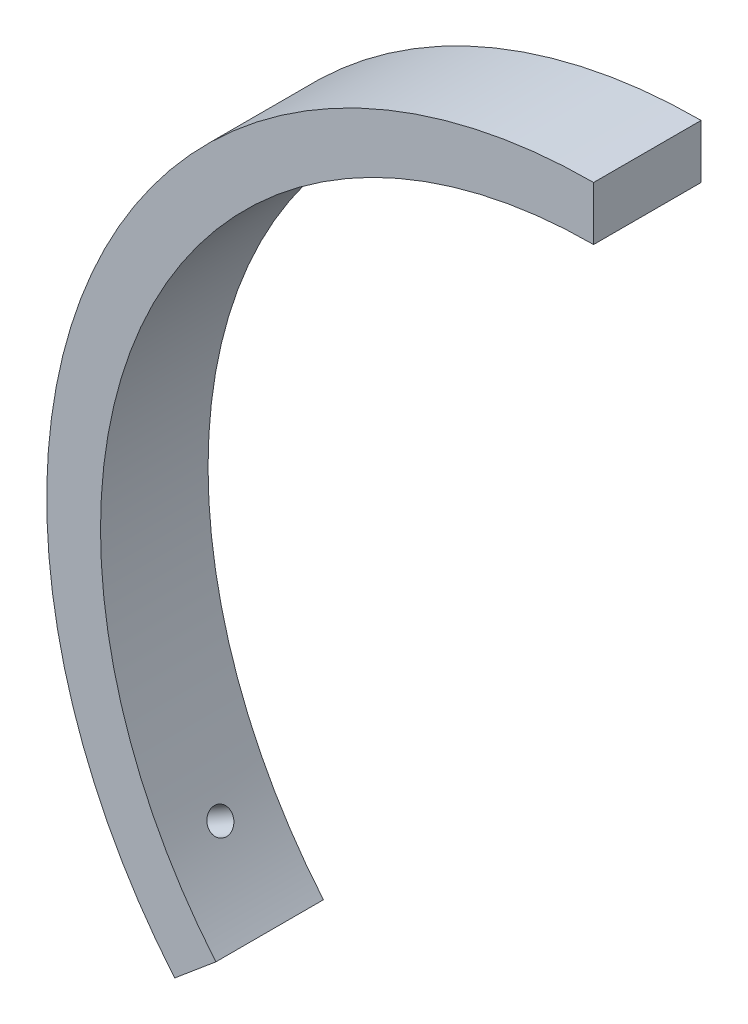
ISO-10303-21;
HEADER;
FILE_DESCRIPTION(('STEP AP214'),'2;1');
FILE_NAME('part.step','',(''),(''),'','','');
FILE_SCHEMA(('AUTOMOTIVE_DESIGN { 1 0 10303 214 1 1 1 1 }'));
ENDSEC;
DATA;
#1=APPLICATION_CONTEXT('core data for automotive mechanical design processes');
#2=APPLICATION_PROTOCOL_DEFINITION('international standard','automotive_design',2000,#1);
#3=PRODUCT_CONTEXT('',#1,'mechanical');
#4=PRODUCT('Part','Part','',(#3));
#5=PRODUCT_RELATED_PRODUCT_CATEGORY('part','',(#4));
#6=PRODUCT_DEFINITION_FORMATION('','',#4);
#7=PRODUCT_DEFINITION_CONTEXT('part definition',#1,'design');
#8=PRODUCT_DEFINITION('design','',#6,#7);
#9=PRODUCT_DEFINITION_SHAPE('','',#8);
#10=(LENGTH_UNIT() NAMED_UNIT(*) SI_UNIT(.MILLI.,.METRE.));
#11=(NAMED_UNIT(*) PLANE_ANGLE_UNIT() SI_UNIT($,.RADIAN.));
#12=(NAMED_UNIT(*) SI_UNIT($,.STERADIAN.) SOLID_ANGLE_UNIT());
#13=UNCERTAINTY_MEASURE_WITH_UNIT(LENGTH_MEASURE(1.E-05),#10,'distance_accuracy_value','');
#14=(GEOMETRIC_REPRESENTATION_CONTEXT(3) GLOBAL_UNCERTAINTY_ASSIGNED_CONTEXT((#13)) GLOBAL_UNIT_ASSIGNED_CONTEXT((#10,
#11,#12)) REPRESENTATION_CONTEXT('',''));
#15=CARTESIAN_POINT('',(0.,0.,0.));
#16=DIRECTION('',(0.,0.,1.));
#17=DIRECTION('',(1.,0.,0.));
#18=AXIS2_PLACEMENT_3D('',#15,#16,#17);
#19=CARTESIAN_POINT('',(0.,0.,20.));
#20=DIRECTION('',(0.,0.,-1.));
#21=DIRECTION('',(-1.,0.,0.));
#22=AXIS2_PLACEMENT_3D('',#19,#20,#21);
#23=CYLINDRICAL_SURFACE('',#22,101.7);
#24=CARTESIAN_POINT('',(-87.6731606146973,-51.5393724636004,5.37138605957881));
#25=CARTESIAN_POINT('',(-87.7893116330558,-51.3417876048177,5.33006265687796));
#26=CARTESIAN_POINT('',(-87.9064585888786,-51.1409689136169,5.30654677979392));
#27=CARTESIAN_POINT('',(-88.1398383984182,-50.7376908596725,5.29582330103893));
#28=CARTESIAN_POINT('',(-88.2560704703865,-50.5352303424387,5.3086439505002));
#29=CARTESIAN_POINT('',(-88.4942774234178,-50.1170168847732,5.37286532123307));
#30=CARTESIAN_POINT('',(-88.6159312601271,-49.9015508898564,5.42737171335312));
#31=CARTESIAN_POINT('',(-88.8515868699187,-49.480741339662,5.57688931514213));
#32=CARTESIAN_POINT('',(-88.9655877767914,-49.275398930936,5.67190510101817));
#33=CARTESIAN_POINT('',(-89.1837527546582,-48.8794403309165,5.90014047000529));
#34=CARTESIAN_POINT('',(-89.2878554164266,-48.688917257579,6.03358016859668));
#35=CARTESIAN_POINT('',(-89.4830664481307,-48.329212469479,6.33438000324875));
#36=CARTESIAN_POINT('',(-89.5741740931517,-48.1600319453513,6.50174203037455));
#37=CARTESIAN_POINT('',(-89.7430198205838,-47.8446761684187,6.8688629444793));
#38=CARTESIAN_POINT('',(-89.8204824720964,-47.6989790179213,7.06915905003311));
#39=CARTESIAN_POINT('',(-89.958420060891,-47.4383228362987,7.49411402617155));
#40=CARTESIAN_POINT('',(-90.0188930193309,-47.3233673858294,7.71877573047248));
#41=CARTESIAN_POINT('',(-90.1228603795412,-47.1250772328914,8.19130465911183));
#42=CARTESIAN_POINT('',(-90.1659589650372,-47.0424807879636,8.4395689001985));
#43=CARTESIAN_POINT('',(-90.2325058300599,-46.914711058343,8.94807336455945));
#44=CARTESIAN_POINT('',(-90.2559522860642,-46.8695412464741,9.20831469682577));
#45=CARTESIAN_POINT('',(-90.2830069158963,-46.817406678049,9.73779395481841));
#46=CARTESIAN_POINT('',(-90.286295269389,-46.8110578434364,10.0071090795251));
#47=CARTESIAN_POINT('',(-90.2721221548282,-46.8383836783286,10.5431602043939));
#48=CARTESIAN_POINT('',(-90.2546596969395,-46.8720602570873,10.8098960809114));
#49=CARTESIAN_POINT('',(-90.1991563780707,-46.9787802494058,11.3344735671105));
#50=CARTESIAN_POINT('',(-90.1610206715675,-47.0520050982691,11.5922683107071));
#51=CARTESIAN_POINT('',(-90.0647994016363,-47.2359250891052,12.09017809346));
#52=CARTESIAN_POINT('',(-90.0067142416321,-47.346619473357,12.3302934900142));
#53=CARTESIAN_POINT('',(-89.8722672086801,-47.6013243433578,12.7838336874709));
#54=CARTESIAN_POINT('',(-89.7960567956803,-47.7450584229003,12.9974584625443));
#55=CARTESIAN_POINT('',(-89.6266985116987,-48.0622214570176,13.3937195909682));
#56=CARTESIAN_POINT('',(-89.5335522622222,-48.2356475686648,13.5763589077581));
#57=CARTESIAN_POINT('',(-89.3343302334667,-48.6036039255416,13.9017523095551));
#58=CARTESIAN_POINT('',(-89.2285275830666,-48.79768093828,14.045185910872));
#59=CARTESIAN_POINT('',(-89.0052343568402,-49.2037787692609,14.2919558649287));
#60=CARTESIAN_POINT('',(-88.8877453711749,-49.4157971456357,14.3952976636126));
#61=CARTESIAN_POINT('',(-88.6468853545354,-49.8465568692261,14.5566291143314));
#62=CARTESIAN_POINT('',(-88.5237007135631,-50.0650475194028,14.6155669404087));
#63=CARTESIAN_POINT('',(-88.2725120762428,-50.5066142109021,14.6898387182743));
#64=CARTESIAN_POINT('',(-88.1445085694639,-50.7296897853827,14.7051770874693));
#65=CARTESIAN_POINT('',(-87.8892731793871,-51.1705933175647,14.6918448605747));
#66=CARTESIAN_POINT('',(-87.7620574115498,-51.3884502985518,14.6638149328291));
#67=CARTESIAN_POINT('',(-87.5102500502238,-51.8160953233809,14.5658486478778));
#68=CARTESIAN_POINT('',(-87.3856584134618,-52.0258835003292,14.4959129822818));
#69=CARTESIAN_POINT('',(-87.1427212178819,-52.4317859325544,14.3163151657449));
#70=CARTESIAN_POINT('',(-87.0243794495851,-52.6278919122632,14.2066292163549));
#71=CARTESIAN_POINT('',(-86.7975353179302,-53.0011852710067,13.9509326103969));
#72=CARTESIAN_POINT('',(-86.6890335892688,-53.1783714298163,13.8049196129527));
#73=CARTESIAN_POINT('',(-86.4835195568123,-53.5119601271126,13.4784380021359));
#74=CARTESIAN_POINT('',(-86.3867067034267,-53.6680062724526,13.2974799201985));
#75=CARTESIAN_POINT('',(-86.2094126961625,-53.9523429569673,12.9078855341675));
#76=CARTESIAN_POINT('',(-86.128933267347,-54.0806305645042,12.6992463103602));
#77=CARTESIAN_POINT('',(-85.9851337272031,-54.308981271561,12.2553616304044));
#78=CARTESIAN_POINT('',(-85.922223864525,-54.4083714989009,12.0196370698104));
#79=CARTESIAN_POINT('',(-85.8178338247675,-54.5728772778996,11.5320371096162));
#80=CARTESIAN_POINT('',(-85.7763558916115,-54.6379892406371,11.2801600219484));
#81=CARTESIAN_POINT('',(-85.715520145745,-54.7333802116288,10.7624221522776));
#82=CARTESIAN_POINT('',(-85.6965842853602,-54.7629948332925,10.4963891668723));
#83=CARTESIAN_POINT('',(-85.6828204868774,-54.7845273658888,9.96217524836672));
#84=CARTESIAN_POINT('',(-85.687994125781,-54.7764428109192,9.69399417590553));
#85=CARTESIAN_POINT('',(-85.7224394822637,-54.7225217970382,9.16070441254647));
#86=CARTESIAN_POINT('',(-85.7519152687983,-54.6763656434672,8.89564108879532));
#87=CARTESIAN_POINT('',(-85.8343036648466,-54.5469353145662,8.37853180452171));
#88=CARTESIAN_POINT('',(-85.8872156944271,-54.4636620577039,8.12648552206299));
#89=CARTESIAN_POINT('',(-86.0145285906156,-54.2623712210915,7.64379752727602));
#90=CARTESIAN_POINT('',(-86.0888381298458,-54.1445012641202,7.41307023796452));
#91=CARTESIAN_POINT('',(-86.256683118346,-53.8767064021572,6.97872178712104));
#92=CARTESIAN_POINT('',(-86.3502207385159,-53.726777877594,6.77510369056728));
#93=CARTESIAN_POINT('',(-86.5518892354175,-53.4012780981364,6.40429753594902));
#94=CARTESIAN_POINT('',(-86.6597720799409,-53.2261392251365,6.23659482648169));
#95=CARTESIAN_POINT('',(-86.8877007116658,-52.8532399599665,5.93914637551925));
#96=CARTESIAN_POINT('',(-87.0077336107077,-52.6555035100103,5.809360969779));
#97=CARTESIAN_POINT('',(-87.2189609069851,-52.3046030563924,5.62436487477632));
#98=CARTESIAN_POINT('',(-87.3080824281518,-52.1557288610119,5.55845686471806));
#99=CARTESIAN_POINT('',(-87.4889797985673,-51.8517085505529,5.44840767293308));
#100=CARTESIAN_POINT('',(-87.5807550311265,-51.6965638893716,5.40426147639104));
#101=CARTESIAN_POINT('',(-87.6731606146973,-51.5393724636004,5.37138605957881));
#102=B_SPLINE_CURVE_WITH_KNOTS('',3,(#24,#25,#26,#27,#28,#29,#30,#31,#32,#33,#34,#35,#36,#37,
#38,#39,#40,#41,#42,#43,#44,#45,#46,#47,#48,#49,#50,#51,#52,#53,#54,#55,#56,#57,#58,#59,#60,#61,
#62,#63,#64,#65,#66,#67,#68,#69,#70,#71,#72,#73,#74,#75,#76,#77,#78,#79,#80,#81,#82,#83,#84,#85,
#86,#87,#88,#89,#90,#91,#92,#93,#94,#95,#96,#97,#98,#99,#100,#101),.UNSPECIFIED.,.T.,.F.,(4,2,2,
2,2,2,2,2,2,2,2,2,2,2,2,2,2,2,2,2,2,2,2,2,2,2,2,2,2,2,2,2,2,2,2,2,2,2,4),(0.,0.698100781084419,
1.39674447444748,2.15321933193793,2.90977966844717,3.67076333220916,4.43178943013516,
5.20675400716698,5.98180880933315,6.77363901890721,7.56554269432211,8.36997854588397,
9.17445277141288,9.98264942164338,10.7908297292403,11.5924802790987,12.3940541160796,
13.180698404476,13.9672358001464,14.7364608098151,15.5056078804209,16.2635005608633,
17.0213807334329,17.7797153996165,18.5380989447379,19.3079967335326,20.0779757932101,
20.8646631935143,21.6514329433219,22.4527091775072,23.2540378238858,24.0621647170801,
24.870271614175,25.6749792713004,26.4797778319348,27.2721312664271,28.0636528494723,
28.6191648609235,29.1745487996866),.UNSPECIFIED.);
#103=CARTESIAN_POINT('',(-87.6731606146973,-51.5393724636004,5.37138605957881));
#104=VERTEX_POINT('',#103);
#105=EDGE_CURVE('E11',#104,#104,#102,.T.);
#106=ORIENTED_EDGE('',*,*,#105,.T.);
#107=EDGE_LOOP('',(#106));
#108=FACE_BOUND('',#107,.T.);
#109=CARTESIAN_POINT('',(0.,0.,0.));
#110=DIRECTION('',(0.,0.,1.));
#111=DIRECTION('',(1.,0.,0.));
#112=AXIS2_PLACEMENT_3D('',#109,#110,#111);
#113=CIRCLE('',#112,101.7);
#114=CARTESIAN_POINT('',(0.,101.7,0.));
#115=VERTEX_POINT('',#114);
#116=CARTESIAN_POINT('',(-77.9067198652002,-65.371499905121,0.));
#117=VERTEX_POINT('',#116);
#118=EDGE_CURVE('E113',#115,#117,#113,.T.);
#119=ORIENTED_EDGE('',*,*,#118,.T.);
#120=DIRECTION('',(0.,0.,-1.));
#121=VECTOR('',#120,1.);
#122=CARTESIAN_POINT('',(-77.9067198652002,-65.371499905121,20.));
#123=LINE('',#122,#121);
#124=CARTESIAN_POINT('',(-77.9067198652002,-65.371499905121,20.));
#125=VERTEX_POINT('',#124);
#126=EDGE_CURVE('E56',#125,#117,#123,.T.);
#127=ORIENTED_EDGE('',*,*,#126,.F.);
#128=CARTESIAN_POINT('',(0.,0.,20.));
#129=DIRECTION('',(0.,0.,1.));
#130=DIRECTION('',(1.,0.,0.));
#131=AXIS2_PLACEMENT_3D('',#128,#129,#130);
#132=CIRCLE('',#131,101.7);
#133=CARTESIAN_POINT('',(0.,101.7,20.));
#134=VERTEX_POINT('',#133);
#135=EDGE_CURVE('E88',#134,#125,#132,.T.);
#136=ORIENTED_EDGE('',*,*,#135,.F.);
#137=DIRECTION('',(0.,0.,-1.));
#138=VECTOR('',#137,1.);
#139=CARTESIAN_POINT('',(0.,101.7,20.));
#140=LINE('',#139,#138);
#141=EDGE_CURVE('E109',#134,#115,#140,.T.);
#142=ORIENTED_EDGE('',*,*,#141,.T.);
#143=EDGE_LOOP('',(#119,#127,#136,#142));
#144=FACE_BOUND('',#143,.T.);
#145=ADVANCED_FACE('F41',(#108,#144),#23,.T.);
#146=CARTESIAN_POINT('',(0.,0.,20.));
#147=DIRECTION('',(0.642787609686538,-0.766044443118979,0.));
#148=DIRECTION('',(0.766044443118979,0.642787609686538,0.));
#149=AXIS2_PLACEMENT_3D('',#146,#147,#148);
#150=PLANE('',#149);
#151=DIRECTION('',(-0.766044443118979,-0.642787609686538,0.));
#152=VECTOR('',#151,1.);
#153=CARTESIAN_POINT('',(0.,0.,0.));
#154=LINE('',#153,#152);
#155=CARTESIAN_POINT('',(-70.2462754340104,-58.9436238082556,0.));
#156=VERTEX_POINT('',#155);
#157=EDGE_CURVE('E98',#156,#117,#154,.T.);
#158=ORIENTED_EDGE('',*,*,#157,.F.);
#159=DIRECTION('',(0.,0.,-1.));
#160=VECTOR('',#159,1.);
#161=CARTESIAN_POINT('',(-70.2462754340104,-58.9436238082556,20.));
#162=LINE('',#161,#160);
#163=CARTESIAN_POINT('',(-70.2462754340104,-58.9436238082556,20.));
#164=VERTEX_POINT('',#163);
#165=EDGE_CURVE('E94',#164,#156,#162,.T.);
#166=ORIENTED_EDGE('',*,*,#165,.F.);
#167=DIRECTION('',(-0.766044443118979,-0.642787609686538,0.));
#168=VECTOR('',#167,1.);
#169=CARTESIAN_POINT('',(0.,0.,20.));
#170=LINE('',#169,#168);
#171=EDGE_CURVE('E96',#164,#125,#170,.T.);
#172=ORIENTED_EDGE('',*,*,#171,.T.);
#173=ORIENTED_EDGE('',*,*,#126,.T.);
#174=EDGE_LOOP('',(#158,#166,#172,#173));
#175=FACE_BOUND('',#174,.T.);
#176=ADVANCED_FACE('F95',(#175),#150,.T.);
#177=CARTESIAN_POINT('',(0.,0.,20.));
#178=DIRECTION('',(0.,0.,-1.));
#179=DIRECTION('',(-1.,0.,0.));
#180=AXIS2_PLACEMENT_3D('',#177,#178,#179);
#181=CYLINDRICAL_SURFACE('',#180,91.7);
#182=CARTESIAN_POINT('',(-78.2656205102342,-47.7847532812299,10.));
#183=CARTESIAN_POINT('',(-78.2656236318076,-47.7847486201117,9.87363692343285));
#184=CARTESIAN_POINT('',(-78.2711896148588,-47.7756354658249,9.74718270585471));
#185=CARTESIAN_POINT('',(-78.2932969867482,-47.7393975671236,9.497758285892));
#186=CARTESIAN_POINT('',(-78.309851519022,-47.7122512531642,9.37479243984287));
#187=CARTESIAN_POINT('',(-78.3534076959326,-47.6406889854945,9.13599430159358));
#188=CARTESIAN_POINT('',(-78.3804042697331,-47.5962814140982,9.0201585784823));
#189=CARTESIAN_POINT('',(-78.4439852038762,-47.4914195058461,8.79888591241833));
#190=CARTESIAN_POINT('',(-78.4805672092826,-47.4309691103232,8.69344642407721));
#191=CARTESIAN_POINT('',(-78.5621898370563,-47.2956504813954,8.49588944369544));
#192=CARTESIAN_POINT('',(-78.6072329322359,-47.2207780328821,8.40377586020987));
#193=CARTESIAN_POINT('',(-78.7043801442952,-47.0586809774138,8.23551809461001));
#194=CARTESIAN_POINT('',(-78.7564845409362,-46.9714558810538,8.15937454551635));
#195=CARTESIAN_POINT('',(-78.8661705955602,-46.7870562003433,8.02521479750834));
#196=CARTESIAN_POINT('',(-78.9237528416096,-46.6898805476799,7.96720054770924));
#197=CARTESIAN_POINT('',(-79.0426619786805,-46.4882917290246,7.87095906402027));
#198=CARTESIAN_POINT('',(-79.1039888571679,-46.3838785872579,7.83273176390357));
#199=CARTESIAN_POINT('',(-79.2285673052162,-46.1707628905713,7.77715662963742));
#200=CARTESIAN_POINT('',(-79.2918184831358,-46.0620612071538,7.75980457563598));
#201=CARTESIAN_POINT('',(-79.4184299112134,-45.8434177078927,7.74645951020535));
#202=CARTESIAN_POINT('',(-79.4817901610147,-45.7334758960998,7.7504664290308));
#203=CARTESIAN_POINT('',(-79.6068141873745,-45.5155019966988,7.77972195919829));
#204=CARTESIAN_POINT('',(-79.6684783258359,-45.4074695034819,7.80496600224749));
#205=CARTESIAN_POINT('',(-79.7884191941834,-45.1963815917779,7.87597213605008));
#206=CARTESIAN_POINT('',(-79.8466959179018,-45.0933261823529,7.92173426416034));
#207=CARTESIAN_POINT('',(-79.9582921476212,-44.8951496875136,8.03248278178278));
#208=CARTESIAN_POINT('',(-80.0116111126083,-44.8000294681406,8.09747126613675));
#209=CARTESIAN_POINT('',(-80.1118737859085,-44.6204915768785,8.24482612392297));
#210=CARTESIAN_POINT('',(-80.1588174853279,-44.5360739199198,8.32719252159753));
#211=CARTESIAN_POINT('',(-80.2451234840933,-44.3803796839506,8.50699099402178));
#212=CARTESIAN_POINT('',(-80.284483781115,-44.3091065758436,8.60442703555646));
#213=CARTESIAN_POINT('',(-80.354603804329,-44.1818169120052,8.81158491982618));
#214=CARTESIAN_POINT('',(-80.3853635292177,-44.1258003585864,8.92130676442362));
#215=CARTESIAN_POINT('',(-80.4375091042752,-44.0306721089047,9.14992383726267));
#216=CARTESIAN_POINT('',(-80.4588948934593,-43.9915605226215,9.26881912517866));
#217=CARTESIAN_POINT('',(-80.4917599584802,-43.9313983831992,9.51240703657727));
#218=CARTESIAN_POINT('',(-80.5032392525214,-43.9103477968708,9.63709964940615));
#219=CARTESIAN_POINT('',(-80.5160058069759,-43.8869341682758,9.88870775887593));
#220=CARTESIAN_POINT('',(-80.5172957248277,-43.8845662534783,10.0156226672768));
#221=CARTESIAN_POINT('',(-80.5096587179809,-43.8985753108233,10.2681032784172));
#222=CARTESIAN_POINT('',(-80.5007318010463,-43.9149522687214,10.3936689821819));
#223=CARTESIAN_POINT('',(-80.4728832979517,-43.9659628491914,10.639871330327));
#224=CARTESIAN_POINT('',(-80.4539629211486,-44.0005942627026,10.760508569222));
#225=CARTESIAN_POINT('',(-80.4065978732613,-44.0870892176149,10.9934477382314));
#226=CARTESIAN_POINT('',(-80.3781531897562,-44.1389527814888,11.1057496574753));
#227=CARTESIAN_POINT('',(-80.3124452960756,-44.2583976214394,11.3188558769861));
#228=CARTESIAN_POINT('',(-80.2751802567442,-44.325982157664,11.4196577859589));
#229=CARTESIAN_POINT('',(-80.1927810613704,-44.4748815229401,11.6068785605252));
#230=CARTESIAN_POINT('',(-80.1476468908451,-44.5561963772619,11.6932973996465));
#231=CARTESIAN_POINT('',(-80.0506644114338,-44.7302026759565,11.8493173786471));
#232=CARTESIAN_POINT('',(-79.9988146774414,-44.8228965348439,11.9189149398809));
#233=CARTESIAN_POINT('',(-79.88977430385,-45.0169560561817,12.0392922359785));
#234=CARTESIAN_POINT('',(-79.8325836741722,-45.1183217025236,12.0900720057969));
#235=CARTESIAN_POINT('',(-79.714407280841,-45.3267869391484,12.171366006957));
#236=CARTESIAN_POINT('',(-79.6534219535068,-45.433885870014,12.2018825634969));
#237=CARTESIAN_POINT('',(-79.5293281945249,-45.6507563882171,12.241791518377));
#238=CARTESIAN_POINT('',(-79.4662197628535,-45.7605279755844,12.2511839164819));
#239=CARTESIAN_POINT('',(-79.3396722338786,-45.9795868440687,12.2485776427374));
#240=CARTESIAN_POINT('',(-79.2762332283575,-46.0888742454955,12.236584622665));
#241=CARTESIAN_POINT('',(-79.1508304064626,-46.3039041955134,12.1915595454562));
#242=CARTESIAN_POINT('',(-79.0888665930271,-46.4096467370442,12.1585274464178));
#243=CARTESIAN_POINT('',(-78.9682294043522,-46.6146210906344,12.0723623882078));
#244=CARTESIAN_POINT('',(-78.909556087056,-46.7138527880482,12.0192290751972));
#245=CARTESIAN_POINT('',(-78.7972546870713,-46.9030358350048,11.8943725575734));
#246=CARTESIAN_POINT('',(-78.7436264168544,-46.9929875295048,11.8226500443083));
#247=CARTESIAN_POINT('',(-78.6430321875637,-47.1611398008599,11.662637323475));
#248=CARTESIAN_POINT('',(-78.5960672815112,-47.2393385204904,11.5743445023862));
#249=CARTESIAN_POINT('',(-78.5102457453378,-47.3818346233771,11.383674554477));
#250=CARTESIAN_POINT('',(-78.4713911283265,-47.4461285553748,11.2812939412695));
#251=CARTESIAN_POINT('',(-78.4029981658759,-47.5590606902132,11.0653219536025));
#252=CARTESIAN_POINT('',(-78.3734653450237,-47.6076896094926,10.9517239833025));
#253=CARTESIAN_POINT('',(-78.3247059551122,-47.6878670092393,10.7166758939017));
#254=CARTESIAN_POINT('',(-78.3054670746556,-47.7194358937045,10.5952353501831));
#255=CARTESIAN_POINT('',(-78.2830156142081,-47.7562532203224,10.3941878426015));
#256=CARTESIAN_POINT('',(-78.2765014500823,-47.766927801724,10.3158863126379));
#257=CARTESIAN_POINT('',(-78.2678029200397,-47.7811792925438,10.1584017951243));
#258=CARTESIAN_POINT('',(-78.2656185532755,-47.7847562033511,10.079218807747));
#259=CARTESIAN_POINT('',(-78.2656205102342,-47.7847532812299,10.));
#260=B_SPLINE_CURVE_WITH_KNOTS('',3,(#182,#183,#184,#185,#186,#187,#188,#189,#190,#191,#192,
#193,#194,#195,#196,#197,#198,#199,#200,#201,#202,#203,#204,#205,#206,#207,#208,#209,#210,#211,
#212,#213,#214,#215,#216,#217,#218,#219,#220,#221,#222,#223,#224,#225,#226,#227,#228,#229,#230,
#231,#232,#233,#234,#235,#236,#237,#238,#239,#240,#241,#242,#243,#244,#245,#246,#247,#248,#249,
#250,#251,#252,#253,#254,#255,#256,#257,#258,#259),.UNSPECIFIED.,.T.,.F.,(4,2,2,2,2,2,2,2,2,2,2,
2,2,2,2,2,2,2,2,2,2,2,2,2,2,2,2,2,2,2,2,2,2,2,2,2,2,2,4),(0.,0.378800074193792,
0.758054050667171,1.13712408560226,1.51610107829431,1.89518900246264,2.27429195008933,
2.65343564177951,3.03257806446913,3.41164383206789,3.79070836187007,4.16969137238964,
4.54867507291878,4.9277000815074,5.30672561884169,5.68585109747745,6.06497663358449,
6.44410463615816,6.82323194203569,7.20226036641234,7.58128850276096,7.9602707815904,
8.33925355466158,8.71831498973294,9.0973771224643,9.47651982798731,9.85566182923695,
10.2347603165251,10.6138588080384,10.9928571255676,11.3718561979239,11.7508619420617,
12.1298535926739,12.5089050693435,12.8880505213439,13.2674202548157,13.6463352478506,
13.8838104418736,14.1212855894192),.UNSPECIFIED.);
#261=CARTESIAN_POINT('',(-78.2656205102342,-47.7847532812299,10.));
#262=VERTEX_POINT('',#261);
#263=EDGE_CURVE('E45',#262,#262,#260,.T.);
#264=ORIENTED_EDGE('',*,*,#263,.F.);
#265=EDGE_LOOP('',(#264));
#266=FACE_BOUND('',#265,.T.);
#267=CARTESIAN_POINT('',(0.,0.,0.));
#268=DIRECTION('',(0.,0.,1.));
#269=DIRECTION('',(1.,0.,0.));
#270=AXIS2_PLACEMENT_3D('',#267,#268,#269);
#271=CIRCLE('',#270,91.7);
#272=CARTESIAN_POINT('',(0.,91.7,0.));
#273=VERTEX_POINT('',#272);
#274=EDGE_CURVE('E117',#273,#156,#271,.T.);
#275=ORIENTED_EDGE('',*,*,#274,.F.);
#276=DIRECTION('',(0.,0.,-1.));
#277=VECTOR('',#276,1.);
#278=CARTESIAN_POINT('',(0.,91.7,20.));
#279=LINE('',#278,#277);
#280=CARTESIAN_POINT('',(0.,91.7,20.));
#281=VERTEX_POINT('',#280);
#282=EDGE_CURVE('E80',#281,#273,#279,.T.);
#283=ORIENTED_EDGE('',*,*,#282,.F.);
#284=CARTESIAN_POINT('',(0.,0.,20.));
#285=DIRECTION('',(0.,0.,1.));
#286=DIRECTION('',(1.,0.,0.));
#287=AXIS2_PLACEMENT_3D('',#284,#285,#286);
#288=CIRCLE('',#287,91.7);
#289=EDGE_CURVE('E105',#281,#164,#288,.T.);
#290=ORIENTED_EDGE('',*,*,#289,.T.);
#291=ORIENTED_EDGE('',*,*,#165,.T.);
#292=EDGE_LOOP('',(#275,#283,#290,#291));
#293=FACE_BOUND('',#292,.T.);
#294=ADVANCED_FACE('F107',(#266,#293),#181,.F.);
#295=CARTESIAN_POINT('',(0.,0.,20.));
#296=DIRECTION('',(-1.,0.,0.));
#297=DIRECTION('',(0.,0.,1.));
#298=AXIS2_PLACEMENT_3D('',#295,#296,#297);
#299=PLANE('',#298);
#300=DIRECTION('',(0.,1.,0.));
#301=VECTOR('',#300,1.);
#302=CARTESIAN_POINT('',(0.,0.,0.));
#303=LINE('',#302,#301);
#304=EDGE_CURVE('E83',#273,#115,#303,.T.);
#305=ORIENTED_EDGE('',*,*,#304,.T.);
#306=ORIENTED_EDGE('',*,*,#141,.F.);
#307=DIRECTION('',(0.,1.,0.));
#308=VECTOR('',#307,1.);
#309=CARTESIAN_POINT('',(0.,0.,20.));
#310=LINE('',#309,#308);
#311=EDGE_CURVE('E64',#281,#134,#310,.T.);
#312=ORIENTED_EDGE('',*,*,#311,.F.);
#313=ORIENTED_EDGE('',*,*,#282,.T.);
#314=EDGE_LOOP('',(#305,#306,#312,#313));
#315=FACE_BOUND('',#314,.T.);
#316=ADVANCED_FACE('F138',(#315),#299,.F.);
#317=CARTESIAN_POINT('',(0.,0.,20.));
#318=DIRECTION('',(0.,0.,1.));
#319=DIRECTION('',(1.,0.,0.));
#320=AXIS2_PLACEMENT_3D('',#317,#318,#319);
#321=PLANE('',#320);
#322=ORIENTED_EDGE('',*,*,#135,.T.);
#323=ORIENTED_EDGE('',*,*,#171,.F.);
#324=ORIENTED_EDGE('',*,*,#289,.F.);
#325=ORIENTED_EDGE('',*,*,#311,.T.);
#326=EDGE_LOOP('',(#322,#323,#324,#325));
#327=FACE_BOUND('',#326,.T.);
#328=ADVANCED_FACE('F104',(#327),#321,.T.);
#329=CARTESIAN_POINT('',(0.,0.,0.));
#330=DIRECTION('',(0.,0.,1.));
#331=DIRECTION('',(1.,0.,0.));
#332=AXIS2_PLACEMENT_3D('',#329,#330,#331);
#333=PLANE('',#332);
#334=ORIENTED_EDGE('',*,*,#118,.F.);
#335=ORIENTED_EDGE('',*,*,#304,.F.);
#336=ORIENTED_EDGE('',*,*,#274,.T.);
#337=ORIENTED_EDGE('',*,*,#157,.T.);
#338=EDGE_LOOP('',(#334,#335,#336,#337));
#339=FACE_BOUND('',#338,.T.);
#340=ADVANCED_FACE('F130',(#339),#333,.F.);
#341=CARTESIAN_POINT('',(-88.0747835648775,-50.8499999999998,10.));
#342=DIRECTION('',(-0.86602540378444,-0.499999999999998,0.));
#343=DIRECTION('',(0.499999999999998,-0.86602540378444,0.));
#344=AXIS2_PLACEMENT_3D('',#341,#342,#343);
#345=CONICAL_SURFACE('',#344,4.7,0.785398163397448);
#346=CARTESIAN_POINT('',(-85.9530213256056,-49.6249999999998,10.));
#347=DIRECTION('',(-0.86602540378444,-0.499999999999998,0.));
#348=DIRECTION('',(0.499999999999998,-0.86602540378444,0.));
#349=AXIS2_PLACEMENT_3D('',#346,#347,#348);
#350=CIRCLE('',#349,2.25);
#351=CARTESIAN_POINT('',(-84.8280213256057,-51.5735571585148,10.));
#352=VERTEX_POINT('',#351);
#353=EDGE_CURVE('E157',#352,#352,#350,.T.);
#354=ORIENTED_EDGE('',*,*,#353,.F.);
#355=EDGE_LOOP('',(#354));
#356=FACE_BOUND('',#355,.T.);
#357=ORIENTED_EDGE('',*,*,#105,.F.);
#358=EDGE_LOOP('',(#357));
#359=FACE_BOUND('',#358,.T.);
#360=ADVANCED_FACE('F126',(#356,#359),#345,.F.);
#361=CARTESIAN_POINT('',(-88.0747835648775,-50.8499999999998,10.));
#362=DIRECTION('',(-0.86602540378444,-0.499999999999998,0.));
#363=DIRECTION('',(0.499999999999998,-0.86602540378444,0.));
#364=AXIS2_PLACEMENT_3D('',#361,#362,#363);
#365=CYLINDRICAL_SURFACE('',#364,2.24999999999999);
#366=ORIENTED_EDGE('',*,*,#263,.T.);
#367=EDGE_LOOP('',(#366));
#368=FACE_BOUND('',#367,.T.);
#369=ORIENTED_EDGE('',*,*,#353,.T.);
#370=EDGE_LOOP('',(#369));
#371=FACE_BOUND('',#370,.T.);
#372=ADVANCED_FACE('F129',(#368,#371),#365,.F.);
#373=CLOSED_SHELL('',(#145,#176,#294,#316,#328,#340,#360,#372));
#374=MANIFOLD_SOLID_BREP('B2',#373);
#375=ADVANCED_BREP_SHAPE_REPRESENTATION('',(#18,#374),#14);
#376=SHAPE_DEFINITION_REPRESENTATION(#9,#375);
ENDSEC;
END-ISO-10303-21;
